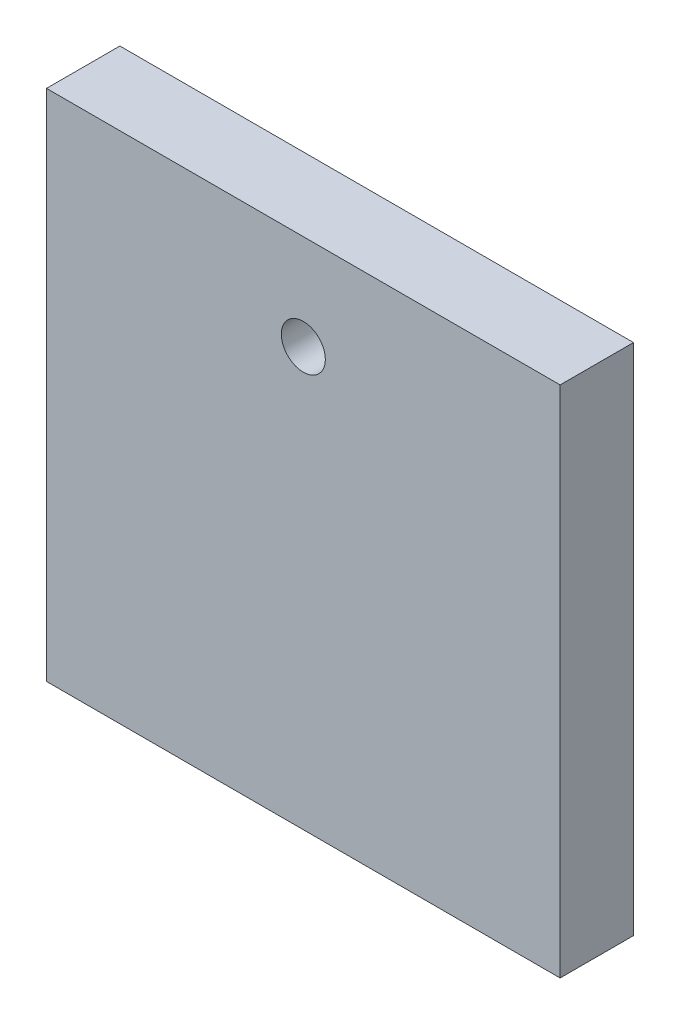
ISO-10303-21;
HEADER;
FILE_DESCRIPTION(('STEP AP214'),'2;1');
FILE_NAME('part.step','',(''),(''),'','','');
FILE_SCHEMA(('AUTOMOTIVE_DESIGN { 1 0 10303 214 1 1 1 1 }'));
ENDSEC;
DATA;
#1=APPLICATION_CONTEXT('core data for automotive mechanical design processes');
#2=APPLICATION_PROTOCOL_DEFINITION('international standard','automotive_design',2000,#1);
#3=PRODUCT_CONTEXT('',#1,'mechanical');
#4=PRODUCT('Part','Part','',(#3));
#5=PRODUCT_RELATED_PRODUCT_CATEGORY('part','',(#4));
#6=PRODUCT_DEFINITION_FORMATION('','',#4);
#7=PRODUCT_DEFINITION_CONTEXT('part definition',#1,'design');
#8=PRODUCT_DEFINITION('design','',#6,#7);
#9=PRODUCT_DEFINITION_SHAPE('','',#8);
#10=(LENGTH_UNIT() NAMED_UNIT(*) SI_UNIT(.MILLI.,.METRE.));
#11=(NAMED_UNIT(*) PLANE_ANGLE_UNIT() SI_UNIT($,.RADIAN.));
#12=(NAMED_UNIT(*) SI_UNIT($,.STERADIAN.) SOLID_ANGLE_UNIT());
#13=UNCERTAINTY_MEASURE_WITH_UNIT(LENGTH_MEASURE(1.E-05),#10,'distance_accuracy_value','');
#14=(GEOMETRIC_REPRESENTATION_CONTEXT(3) GLOBAL_UNCERTAINTY_ASSIGNED_CONTEXT((#13)) GLOBAL_UNIT_ASSIGNED_CONTEXT((#10,
#11,#12)) REPRESENTATION_CONTEXT('',''));
#15=CARTESIAN_POINT('',(0.,0.,0.));
#16=DIRECTION('',(0.,0.,1.));
#17=DIRECTION('',(1.,0.,0.));
#18=AXIS2_PLACEMENT_3D('',#15,#16,#17);
#19=CARTESIAN_POINT('',(17.5,-17.5,5.));
#20=DIRECTION('',(-1.,0.,0.));
#21=DIRECTION('',(0.,0.,1.));
#22=AXIS2_PLACEMENT_3D('',#19,#20,#21);
#23=PLANE('',#22);
#24=DIRECTION('',(0.,1.,0.));
#25=VECTOR('',#24,1.);
#26=CARTESIAN_POINT('',(17.5,-17.5,0.));
#27=LINE('',#26,#25);
#28=CARTESIAN_POINT('',(17.5,-17.5,0.));
#29=VERTEX_POINT('',#28);
#30=CARTESIAN_POINT('',(17.5,17.5,0.));
#31=VERTEX_POINT('',#30);
#32=EDGE_CURVE('E106',#29,#31,#27,.T.);
#33=ORIENTED_EDGE('',*,*,#32,.T.);
#34=DIRECTION('',(0.,0.,-1.));
#35=VECTOR('',#34,1.);
#36=CARTESIAN_POINT('',(17.5,17.5,5.));
#37=LINE('',#36,#35);
#38=CARTESIAN_POINT('',(17.5,17.5,5.));
#39=VERTEX_POINT('',#38);
#40=EDGE_CURVE('E11',#39,#31,#37,.T.);
#41=ORIENTED_EDGE('',*,*,#40,.F.);
#42=DIRECTION('',(0.,1.,0.));
#43=VECTOR('',#42,1.);
#44=CARTESIAN_POINT('',(17.5,-17.5,5.));
#45=LINE('',#44,#43);
#46=CARTESIAN_POINT('',(17.5,-17.5,5.));
#47=VERTEX_POINT('',#46);
#48=EDGE_CURVE('E90',#47,#39,#45,.T.);
#49=ORIENTED_EDGE('',*,*,#48,.F.);
#50=DIRECTION('',(0.,0.,-1.));
#51=VECTOR('',#50,1.);
#52=CARTESIAN_POINT('',(17.5,-17.5,5.));
#53=LINE('',#52,#51);
#54=EDGE_CURVE('E102',#47,#29,#53,.T.);
#55=ORIENTED_EDGE('',*,*,#54,.T.);
#56=EDGE_LOOP('',(#33,#41,#49,#55));
#57=FACE_BOUND('',#56,.T.);
#58=ADVANCED_FACE('F38',(#57),#23,.F.);
#59=CARTESIAN_POINT('',(-17.5,17.5,5.));
#60=DIRECTION('',(0.,-1.,0.));
#61=DIRECTION('',(0.,0.,-1.));
#62=AXIS2_PLACEMENT_3D('',#59,#60,#61);
#63=PLANE('',#62);
#64=DIRECTION('',(-1.,0.,0.));
#65=VECTOR('',#64,1.);
#66=CARTESIAN_POINT('',(-17.5,17.5,0.));
#67=LINE('',#66,#65);
#68=CARTESIAN_POINT('',(-17.5,17.5,0.));
#69=VERTEX_POINT('',#68);
#70=EDGE_CURVE('E95',#31,#69,#67,.T.);
#71=ORIENTED_EDGE('',*,*,#70,.T.);
#72=DIRECTION('',(0.,0.,-1.));
#73=VECTOR('',#72,1.);
#74=CARTESIAN_POINT('',(-17.5,17.5,5.));
#75=LINE('',#74,#73);
#76=CARTESIAN_POINT('',(-17.5,17.5,5.));
#77=VERTEX_POINT('',#76);
#78=EDGE_CURVE('E47',#77,#69,#75,.T.);
#79=ORIENTED_EDGE('',*,*,#78,.F.);
#80=DIRECTION('',(-1.,0.,0.));
#81=VECTOR('',#80,1.);
#82=CARTESIAN_POINT('',(-17.5,17.5,5.));
#83=LINE('',#82,#81);
#84=EDGE_CURVE('E85',#39,#77,#83,.T.);
#85=ORIENTED_EDGE('',*,*,#84,.F.);
#86=ORIENTED_EDGE('',*,*,#40,.T.);
#87=EDGE_LOOP('',(#71,#79,#85,#86));
#88=FACE_BOUND('',#87,.T.);
#89=ADVANCED_FACE('F94',(#88),#63,.F.);
#90=CARTESIAN_POINT('',(-17.5,-17.5,5.));
#91=DIRECTION('',(1.,0.,0.));
#92=DIRECTION('',(0.,0.,-1.));
#93=AXIS2_PLACEMENT_3D('',#90,#91,#92);
#94=PLANE('',#93);
#95=DIRECTION('',(0.,-1.,0.));
#96=VECTOR('',#95,1.);
#97=CARTESIAN_POINT('',(-17.5,-17.5,0.));
#98=LINE('',#97,#96);
#99=CARTESIAN_POINT('',(-17.5,-17.5,0.));
#100=VERTEX_POINT('',#99);
#101=EDGE_CURVE('E72',#69,#100,#98,.T.);
#102=ORIENTED_EDGE('',*,*,#101,.T.);
#103=DIRECTION('',(0.,0.,-1.));
#104=VECTOR('',#103,1.);
#105=CARTESIAN_POINT('',(-17.5,-17.5,5.));
#106=LINE('',#105,#104);
#107=CARTESIAN_POINT('',(-17.5,-17.5,5.));
#108=VERTEX_POINT('',#107);
#109=EDGE_CURVE('E97',#108,#100,#106,.T.);
#110=ORIENTED_EDGE('',*,*,#109,.F.);
#111=DIRECTION('',(0.,-1.,0.));
#112=VECTOR('',#111,1.);
#113=CARTESIAN_POINT('',(-17.5,-17.5,5.));
#114=LINE('',#113,#112);
#115=EDGE_CURVE('E88',#77,#108,#114,.T.);
#116=ORIENTED_EDGE('',*,*,#115,.F.);
#117=ORIENTED_EDGE('',*,*,#78,.T.);
#118=EDGE_LOOP('',(#102,#110,#116,#117));
#119=FACE_BOUND('',#118,.T.);
#120=ADVANCED_FACE('F98',(#119),#94,.F.);
#121=CARTESIAN_POINT('',(-17.5,-17.5,5.));
#122=DIRECTION('',(0.,1.,0.));
#123=DIRECTION('',(0.,0.,1.));
#124=AXIS2_PLACEMENT_3D('',#121,#122,#123);
#125=PLANE('',#124);
#126=DIRECTION('',(1.,0.,0.));
#127=VECTOR('',#126,1.);
#128=CARTESIAN_POINT('',(-17.5,-17.5,0.));
#129=LINE('',#128,#127);
#130=EDGE_CURVE('E78',#100,#29,#129,.T.);
#131=ORIENTED_EDGE('',*,*,#130,.T.);
#132=ORIENTED_EDGE('',*,*,#54,.F.);
#133=DIRECTION('',(1.,0.,0.));
#134=VECTOR('',#133,1.);
#135=CARTESIAN_POINT('',(-17.5,-17.5,5.));
#136=LINE('',#135,#134);
#137=EDGE_CURVE('E55',#108,#47,#136,.T.);
#138=ORIENTED_EDGE('',*,*,#137,.F.);
#139=ORIENTED_EDGE('',*,*,#109,.T.);
#140=EDGE_LOOP('',(#131,#132,#138,#139));
#141=FACE_BOUND('',#140,.T.);
#142=ADVANCED_FACE('F120',(#141),#125,.F.);
#143=CARTESIAN_POINT('',(0.,0.,5.));
#144=DIRECTION('',(0.,0.,-1.));
#145=DIRECTION('',(-1.,0.,0.));
#146=AXIS2_PLACEMENT_3D('',#143,#144,#145);
#147=PLANE('',#146);
#148=CARTESIAN_POINT('',(0.,11.,5.));
#149=DIRECTION('',(0.,0.,-1.));
#150=DIRECTION('',(-1.,0.,0.));
#151=AXIS2_PLACEMENT_3D('',#148,#149,#150);
#152=CIRCLE('',#151,1.5);
#153=CARTESIAN_POINT('',(-1.5,11.,5.));
#154=VERTEX_POINT('',#153);
#155=EDGE_CURVE('E110',#154,#154,#152,.T.);
#156=ORIENTED_EDGE('',*,*,#155,.T.);
#157=EDGE_LOOP('',(#156));
#158=FACE_BOUND('',#157,.T.);
#159=ORIENTED_EDGE('',*,*,#48,.T.);
#160=ORIENTED_EDGE('',*,*,#84,.T.);
#161=ORIENTED_EDGE('',*,*,#115,.T.);
#162=ORIENTED_EDGE('',*,*,#137,.T.);
#163=EDGE_LOOP('',(#159,#160,#161,#162));
#164=FACE_BOUND('',#163,.T.);
#165=ADVANCED_FACE('F86',(#158,#164),#147,.F.);
#166=CARTESIAN_POINT('',(0.,0.,0.));
#167=DIRECTION('',(0.,0.,-1.));
#168=DIRECTION('',(-1.,0.,0.));
#169=AXIS2_PLACEMENT_3D('',#166,#167,#168);
#170=PLANE('',#169);
#171=CARTESIAN_POINT('',(0.,11.,0.));
#172=DIRECTION('',(0.,0.,1.));
#173=DIRECTION('',(1.,0.,0.));
#174=AXIS2_PLACEMENT_3D('',#171,#172,#173);
#175=CIRCLE('',#174,1.5);
#176=CARTESIAN_POINT('',(1.5,11.,0.));
#177=VERTEX_POINT('',#176);
#178=EDGE_CURVE('E130',#177,#177,#175,.T.);
#179=ORIENTED_EDGE('',*,*,#178,.T.);
#180=EDGE_LOOP('',(#179));
#181=FACE_BOUND('',#180,.T.);
#182=ORIENTED_EDGE('',*,*,#32,.F.);
#183=ORIENTED_EDGE('',*,*,#130,.F.);
#184=ORIENTED_EDGE('',*,*,#101,.F.);
#185=ORIENTED_EDGE('',*,*,#70,.F.);
#186=EDGE_LOOP('',(#182,#183,#184,#185));
#187=FACE_BOUND('',#186,.T.);
#188=ADVANCED_FACE('F123',(#181,#187),#170,.T.);
#189=CARTESIAN_POINT('',(0.,11.,0.));
#190=DIRECTION('',(0.,0.,1.));
#191=DIRECTION('',(1.,0.,0.));
#192=AXIS2_PLACEMENT_3D('',#189,#190,#191);
#193=CYLINDRICAL_SURFACE('',#192,1.5);
#194=ORIENTED_EDGE('',*,*,#178,.F.);
#195=EDGE_LOOP('',(#194));
#196=FACE_BOUND('',#195,.T.);
#197=ORIENTED_EDGE('',*,*,#155,.F.);
#198=EDGE_LOOP('',(#197));
#199=FACE_BOUND('',#198,.T.);
#200=ADVANCED_FACE('F136',(#196,#199),#193,.F.);
#201=CLOSED_SHELL('',(#58,#89,#120,#142,#165,#188,#200));
#202=MANIFOLD_SOLID_BREP('B2',#201);
#203=ADVANCED_BREP_SHAPE_REPRESENTATION('',(#18,#202),#14);
#204=SHAPE_DEFINITION_REPRESENTATION(#9,#203);
ENDSEC;
END-ISO-10303-21;
